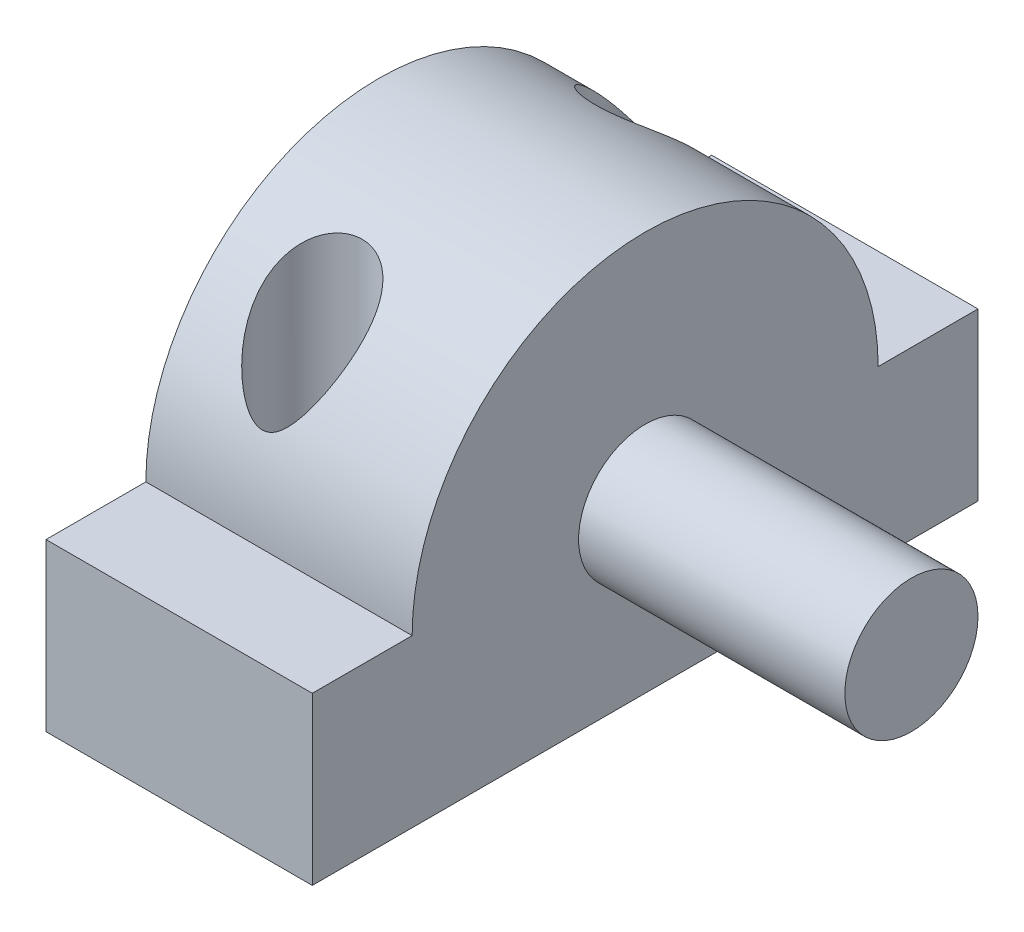
ISO-10303-21;
HEADER;
FILE_DESCRIPTION(('STEP AP214'),'2;1');
FILE_NAME('part.step','',(''),(''),'','','');
FILE_SCHEMA(('AUTOMOTIVE_DESIGN { 1 0 10303 214 1 1 1 1 }'));
ENDSEC;
DATA;
#1=APPLICATION_CONTEXT('core data for automotive mechanical design processes');
#2=APPLICATION_PROTOCOL_DEFINITION('international standard','automotive_design',2000,#1);
#3=PRODUCT_CONTEXT('',#1,'mechanical');
#4=PRODUCT('Part','Part','',(#3));
#5=PRODUCT_RELATED_PRODUCT_CATEGORY('part','',(#4));
#6=PRODUCT_DEFINITION_FORMATION('','',#4);
#7=PRODUCT_DEFINITION_CONTEXT('part definition',#1,'design');
#8=PRODUCT_DEFINITION('design','',#6,#7);
#9=PRODUCT_DEFINITION_SHAPE('','',#8);
#10=(LENGTH_UNIT() NAMED_UNIT(*) SI_UNIT(.MILLI.,.METRE.));
#11=(NAMED_UNIT(*) PLANE_ANGLE_UNIT() SI_UNIT($,.RADIAN.));
#12=(NAMED_UNIT(*) SI_UNIT($,.STERADIAN.) SOLID_ANGLE_UNIT());
#13=UNCERTAINTY_MEASURE_WITH_UNIT(LENGTH_MEASURE(1.E-05),#10,'distance_accuracy_value','');
#14=(GEOMETRIC_REPRESENTATION_CONTEXT(3) GLOBAL_UNCERTAINTY_ASSIGNED_CONTEXT((#13)) GLOBAL_UNIT_ASSIGNED_CONTEXT((#10,
#11,#12)) REPRESENTATION_CONTEXT('',''));
#15=CARTESIAN_POINT('',(0.,0.,0.));
#16=DIRECTION('',(0.,0.,1.));
#17=DIRECTION('',(1.,0.,0.));
#18=AXIS2_PLACEMENT_3D('',#15,#16,#17);
#19=CARTESIAN_POINT('',(8.,0.,0.));
#20=DIRECTION('',(0.,0.,-1.));
#21=DIRECTION('',(-1.,0.,0.));
#22=AXIS2_PLACEMENT_3D('',#19,#20,#21);
#23=PLANE('',#22);
#24=DIRECTION('',(0.,-1.,0.));
#25=VECTOR('',#24,1.);
#26=CARTESIAN_POINT('',(0.,0.,0.));
#27=LINE('',#26,#25);
#28=CARTESIAN_POINT('',(0.,0.,0.));
#29=VERTEX_POINT('',#28);
#30=CARTESIAN_POINT('',(0.,-5.,0.));
#31=VERTEX_POINT('',#30);
#32=EDGE_CURVE('E136',#29,#31,#27,.T.);
#33=ORIENTED_EDGE('',*,*,#32,.T.);
#34=DIRECTION('',(-1.,0.,0.));
#35=VECTOR('',#34,1.);
#36=CARTESIAN_POINT('',(8.,-5.,0.));
#37=LINE('',#36,#35);
#38=CARTESIAN_POINT('',(8.,-5.,0.));
#39=VERTEX_POINT('',#38);
#40=EDGE_CURVE('E11',#39,#31,#37,.T.);
#41=ORIENTED_EDGE('',*,*,#40,.F.);
#42=DIRECTION('',(0.,-1.,0.));
#43=VECTOR('',#42,1.);
#44=CARTESIAN_POINT('',(8.,0.,0.));
#45=LINE('',#44,#43);
#46=CARTESIAN_POINT('',(8.,0.,0.));
#47=VERTEX_POINT('',#46);
#48=EDGE_CURVE('E147',#47,#39,#45,.T.);
#49=ORIENTED_EDGE('',*,*,#48,.F.);
#50=DIRECTION('',(-1.,0.,0.));
#51=VECTOR('',#50,1.);
#52=CARTESIAN_POINT('',(8.,0.,0.));
#53=LINE('',#52,#51);
#54=EDGE_CURVE('E132',#47,#29,#53,.T.);
#55=ORIENTED_EDGE('',*,*,#54,.T.);
#56=EDGE_LOOP('',(#33,#41,#49,#55));
#57=FACE_BOUND('',#56,.T.);
#58=ADVANCED_FACE('F45',(#57),#23,.F.);
#59=CARTESIAN_POINT('',(8.,-5.,0.));
#60=DIRECTION('',(0.,1.,0.));
#61=DIRECTION('',(0.,0.,1.));
#62=AXIS2_PLACEMENT_3D('',#59,#60,#61);
#63=PLANE('',#62);
#64=CARTESIAN_POINT('',(3.,-5.,-5.));
#65=DIRECTION('',(0.,-1.,0.));
#66=DIRECTION('',(0.,0.,-1.));
#67=AXIS2_PLACEMENT_3D('',#64,#65,#66);
#68=CIRCLE('',#67,1.5);
#69=CARTESIAN_POINT('',(3.,-5.,-6.5));
#70=VERTEX_POINT('',#69);
#71=EDGE_CURVE('E158',#70,#70,#68,.T.);
#72=ORIENTED_EDGE('',*,*,#71,.F.);
#73=EDGE_LOOP('',(#72));
#74=FACE_BOUND('',#73,.T.);
#75=CARTESIAN_POINT('',(3.,-5.,-15.));
#76=DIRECTION('',(0.,-1.,0.));
#77=DIRECTION('',(0.,0.,1.));
#78=AXIS2_PLACEMENT_3D('',#75,#76,#77);
#79=CIRCLE('',#78,1.5);
#80=CARTESIAN_POINT('',(3.,-5.,-13.5));
#81=VERTEX_POINT('',#80);
#82=EDGE_CURVE('E212',#81,#81,#79,.T.);
#83=ORIENTED_EDGE('',*,*,#82,.F.);
#84=EDGE_LOOP('',(#83));
#85=FACE_BOUND('',#84,.T.);
#86=DIRECTION('',(0.,0.,-1.));
#87=VECTOR('',#86,1.);
#88=CARTESIAN_POINT('',(0.,-5.,0.));
#89=LINE('',#88,#87);
#90=CARTESIAN_POINT('',(0.,-5.,-20.));
#91=VERTEX_POINT('',#90);
#92=EDGE_CURVE('E139',#31,#91,#89,.T.);
#93=ORIENTED_EDGE('',*,*,#92,.T.);
#94=DIRECTION('',(-1.,0.,0.));
#95=VECTOR('',#94,1.);
#96=CARTESIAN_POINT('',(8.,-5.,-20.));
#97=LINE('',#96,#95);
#98=CARTESIAN_POINT('',(8.,-5.,-20.));
#99=VERTEX_POINT('',#98);
#100=EDGE_CURVE('E59',#99,#91,#97,.T.);
#101=ORIENTED_EDGE('',*,*,#100,.F.);
#102=DIRECTION('',(0.,0.,-1.));
#103=VECTOR('',#102,1.);
#104=CARTESIAN_POINT('',(8.,-5.,0.));
#105=LINE('',#104,#103);
#106=EDGE_CURVE('E105',#39,#99,#105,.T.);
#107=ORIENTED_EDGE('',*,*,#106,.F.);
#108=ORIENTED_EDGE('',*,*,#40,.T.);
#109=EDGE_LOOP('',(#93,#101,#107,#108));
#110=FACE_BOUND('',#109,.T.);
#111=ADVANCED_FACE('F191',(#74,#85,#110),#63,.F.);
#112=CARTESIAN_POINT('',(8.,0.,-20.));
#113=DIRECTION('',(0.,0.,1.));
#114=DIRECTION('',(1.,0.,0.));
#115=AXIS2_PLACEMENT_3D('',#112,#113,#114);
#116=PLANE('',#115);
#117=DIRECTION('',(0.,1.,0.));
#118=VECTOR('',#117,1.);
#119=CARTESIAN_POINT('',(0.,0.,-20.));
#120=LINE('',#119,#118);
#121=CARTESIAN_POINT('',(0.,0.,-20.));
#122=VERTEX_POINT('',#121);
#123=EDGE_CURVE('E142',#91,#122,#120,.T.);
#124=ORIENTED_EDGE('',*,*,#123,.T.);
#125=DIRECTION('',(-1.,0.,0.));
#126=VECTOR('',#125,1.);
#127=CARTESIAN_POINT('',(8.,0.,-20.));
#128=LINE('',#127,#126);
#129=CARTESIAN_POINT('',(8.,0.,-20.));
#130=VERTEX_POINT('',#129);
#131=EDGE_CURVE('E127',#130,#122,#128,.T.);
#132=ORIENTED_EDGE('',*,*,#131,.F.);
#133=DIRECTION('',(0.,1.,0.));
#134=VECTOR('',#133,1.);
#135=CARTESIAN_POINT('',(8.,0.,-20.));
#136=LINE('',#135,#134);
#137=EDGE_CURVE('E118',#99,#130,#136,.T.);
#138=ORIENTED_EDGE('',*,*,#137,.F.);
#139=ORIENTED_EDGE('',*,*,#100,.T.);
#140=EDGE_LOOP('',(#124,#132,#138,#139));
#141=FACE_BOUND('',#140,.T.);
#142=ADVANCED_FACE('F197',(#141),#116,.F.);
#143=CARTESIAN_POINT('',(8.,0.,-17.));
#144=DIRECTION('',(0.,-1.,0.));
#145=DIRECTION('',(0.,0.,-1.));
#146=AXIS2_PLACEMENT_3D('',#143,#144,#145);
#147=PLANE('',#146);
#148=DIRECTION('',(0.,0.,1.));
#149=VECTOR('',#148,1.);
#150=CARTESIAN_POINT('',(0.,0.,-17.));
#151=LINE('',#150,#149);
#152=CARTESIAN_POINT('',(0.,0.,-17.));
#153=VERTEX_POINT('',#152);
#154=EDGE_CURVE('E126',#122,#153,#151,.T.);
#155=ORIENTED_EDGE('',*,*,#154,.T.);
#156=DIRECTION('',(-1.,0.,0.));
#157=VECTOR('',#156,1.);
#158=CARTESIAN_POINT('',(8.,0.,-17.));
#159=LINE('',#158,#157);
#160=CARTESIAN_POINT('',(8.,0.,-17.));
#161=VERTEX_POINT('',#160);
#162=EDGE_CURVE('E123',#161,#153,#159,.T.);
#163=ORIENTED_EDGE('',*,*,#162,.F.);
#164=DIRECTION('',(0.,0.,1.));
#165=VECTOR('',#164,1.);
#166=CARTESIAN_POINT('',(8.,0.,-17.));
#167=LINE('',#166,#165);
#168=EDGE_CURVE('E112',#130,#161,#167,.T.);
#169=ORIENTED_EDGE('',*,*,#168,.F.);
#170=ORIENTED_EDGE('',*,*,#131,.T.);
#171=EDGE_LOOP('',(#155,#163,#169,#170));
#172=FACE_BOUND('',#171,.T.);
#173=ADVANCED_FACE('F124',(#172),#147,.F.);
#174=CARTESIAN_POINT('',(8.,0.,-10.));
#175=DIRECTION('',(-1.,0.,0.));
#176=DIRECTION('',(0.,0.,1.));
#177=AXIS2_PLACEMENT_3D('',#174,#175,#176);
#178=CYLINDRICAL_SURFACE('',#177,7.);
#179=CARTESIAN_POINT('',(3.,6.06217782649107,-6.5));
#180=CARTESIAN_POINT('',(3.07488724612899,6.06217677462976,-6.49999634374938));
#181=CARTESIAN_POINT('',(3.14988624091181,6.0589302713698,-6.49435644566424));
#182=CARTESIAN_POINT('',(3.29775974677453,6.0459724803858,-6.47205774478669));
#183=CARTESIAN_POINT('',(3.37062905275264,6.03624654463625,-6.45537397570824));
#184=CARTESIAN_POINT('',(3.51188865566737,6.01049479681937,-6.41188299750404));
#185=CARTESIAN_POINT('',(3.58029019650692,5.9944855713019,-6.38510244900321));
#186=CARTESIAN_POINT('',(3.71106599554074,5.95643101131848,-6.32273786800935));
#187=CARTESIAN_POINT('',(3.77344269810746,5.93438813883361,-6.28715742681158));
#188=CARTESIAN_POINT('',(3.89292525958971,5.88379941758364,-6.20748150702812));
#189=CARTESIAN_POINT('',(3.94978516839445,5.85506078959614,-6.1631411109325));
#190=CARTESIAN_POINT('',(4.05496144917599,5.79205373694304,-6.06867227857916));
#191=CARTESIAN_POINT('',(4.10327468693715,5.75778329243689,-6.01854173006338));
#192=CARTESIAN_POINT('',(4.19602252113023,5.68016067501728,-5.90844851594702));
#193=CARTESIAN_POINT('',(4.23940177401288,5.63621985297474,-5.84801495280211));
#194=CARTESIAN_POINT('',(4.315428429894,5.54312300713837,-5.72451251700034));
#195=CARTESIAN_POINT('',(4.34806891256743,5.49396364727133,-5.66144197439642));
#196=CARTESIAN_POINT('',(4.4167546955706,5.36613782400882,-5.50341581278758));
#197=CARTESIAN_POINT('',(4.44666359778181,5.2847950322343,-5.40794604740489));
#198=CARTESIAN_POINT('',(4.48702326248985,5.11482709893844,-5.21933503664093));
#199=CARTESIAN_POINT('',(4.49743163483481,5.02618652885623,-5.12619929722758));
#200=CARTESIAN_POINT('',(4.50104902374122,4.87255488254904,-4.97347088141769));
#201=CARTESIAN_POINT('',(4.49864351739466,4.80891094018342,-4.91255459865941));
#202=CARTESIAN_POINT('',(4.48691798287046,4.67971570857437,-4.79346831181909));
#203=CARTESIAN_POINT('',(4.4775975223072,4.61416430030517,-4.73529847971197));
#204=CARTESIAN_POINT('',(4.45273959729481,4.48154486847538,-4.6219540018488));
#205=CARTESIAN_POINT('',(4.43719432490148,4.41447504038028,-4.56678321695874));
#206=CARTESIAN_POINT('',(4.40045785583339,4.27931491601703,-4.45970247839746));
#207=CARTESIAN_POINT('',(4.37926743029367,4.21122476032494,-4.4077920805492));
#208=CARTESIAN_POINT('',(4.33095803210965,4.07240049920133,-4.30586401596733));
#209=CARTESIAN_POINT('',(4.30368372443732,4.00164732927497,-4.25594618178696));
#210=CARTESIAN_POINT('',(4.24386068990434,3.85989916659202,-4.15975035645615));
#211=CARTESIAN_POINT('',(4.21131180482271,3.78890416664384,-4.11347247455487));
#212=CARTESIAN_POINT('',(4.14098406635786,3.64716476638046,-4.02461879109314));
#213=CARTESIAN_POINT('',(4.10320460699923,3.57642039607669,-3.98204341940978));
#214=CARTESIAN_POINT('',(4.02220307231857,3.43591555156199,-3.90073146296065));
#215=CARTESIAN_POINT('',(3.97898388887663,3.36615457630842,-3.86199285789354));
#216=CARTESIAN_POINT('',(3.8798090265835,3.21864912727658,-3.78323181836819));
#217=CARTESIAN_POINT('',(3.82291578996759,3.14119045536872,-3.74381869853061));
#218=CARTESIAN_POINT('',(3.73015307569975,3.0291543535705,-3.68921869834723));
#219=CARTESIAN_POINT('',(3.6980432869428,2.99254753229684,-3.67179243844725));
#220=CARTESIAN_POINT('',(3.63088846263601,2.92134191886284,-3.63860900282595));
#221=CARTESIAN_POINT('',(3.59584586051998,2.88674150151201,-3.62285046746037));
#222=CARTESIAN_POINT('',(3.52621368996409,2.82409961021022,-3.59488413495186));
#223=CARTESIAN_POINT('',(3.4919823889331,2.79575315285715,-3.58247669824057));
#224=CARTESIAN_POINT('',(3.42022037285386,2.74257567142704,-3.5595719159984));
#225=CARTESIAN_POINT('',(3.38268960969438,2.71774469862497,-3.54907459832685));
#226=CARTESIAN_POINT('',(3.30970845793241,2.67662176252767,-3.53191530166755));
#227=CARTESIAN_POINT('',(3.27475031859164,2.65961299069627,-3.5249174757353));
#228=CARTESIAN_POINT('',(3.20230836225991,2.63104470432912,-3.51325622013703));
#229=CARTESIAN_POINT('',(3.16483069686261,2.61947243167818,-3.50858732344287));
#230=CARTESIAN_POINT('',(3.0952089702251,2.60481996245347,-3.50269560855217));
#231=CARTESIAN_POINT('',(3.06335642997214,2.60056698943998,-3.50099595542385));
#232=CARTESIAN_POINT('',(2.99933910055876,2.59722432840553,-3.49965923742424));
#233=CARTESIAN_POINT('',(2.96717445835228,2.59813231789171,-3.50002124478201));
#234=CARTESIAN_POINT('',(2.90358057557784,2.60498319234335,-3.50276409220987));
#235=CARTESIAN_POINT('',(2.87214961070624,2.61091271627619,-3.50513957494601));
#236=CARTESIAN_POINT('',(2.81063034627651,2.6271212596488,-3.5116789939386));
#237=CARTESIAN_POINT('',(2.78054349134558,2.63740484006335,-3.51584480567509));
#238=CARTESIAN_POINT('',(2.70467025281412,2.66859541178565,-3.52859978469833));
#239=CARTESIAN_POINT('',(2.66019365694696,2.69218272747631,-3.53834606009046));
#240=CARTESIAN_POINT('',(2.57554205170607,2.74507374800841,-3.56063684660925));
#241=CARTESIAN_POINT('',(2.53538239379682,2.77439687147958,-3.57319088474469));
#242=CARTESIAN_POINT('',(2.45948573723692,2.83614122989274,-3.60020151653892));
#243=CARTESIAN_POINT('',(2.42368526244188,2.86850146032465,-3.61462221700708));
#244=CARTESIAN_POINT('',(2.35512608722087,2.93557413784138,-3.64517737337876));
#245=CARTESIAN_POINT('',(2.32237043013347,2.97028887962106,-3.66131351008476));
#246=CARTESIAN_POINT('',(2.22784672329253,3.076902198012,-3.71200836267158));
#247=CARTESIAN_POINT('',(2.16994533282429,3.1511607865734,-3.74880665612383));
#248=CARTESIAN_POINT('',(2.06268566025289,3.30182194016055,-3.82706304267076));
#249=CARTESIAN_POINT('',(2.01324779920348,3.37819567002254,-3.868470903232));
#250=CARTESIAN_POINT('',(1.92107937133774,3.53238357932364,-3.95598416283341));
#251=CARTESIAN_POINT('',(1.8783543383305,3.6101988886912,-4.00209338641199));
#252=CARTESIAN_POINT('',(1.79919626586278,3.76636025693809,-4.09889929315403));
#253=CARTESIAN_POINT('',(1.76277306560236,3.84470695080468,-4.14960296500745));
#254=CARTESIAN_POINT('',(1.69633682046079,4.00112300924113,-4.25544329469505));
#255=CARTESIAN_POINT('',(1.66632350441654,4.07919238540515,-4.31057976486869));
#256=CARTESIAN_POINT('',(1.61211589215235,4.23724815399855,-4.42723445494009));
#257=CARTESIAN_POINT('',(1.58816787199091,4.31720335410463,-4.48891031997641));
#258=CARTESIAN_POINT('',(1.54824405880129,4.47558462474626,-4.61673887057073));
#259=CARTESIAN_POINT('',(1.53227106024319,4.55401015004254,-4.6828931161582));
#260=CARTESIAN_POINT('',(1.50936200764066,4.70831713386748,-4.8190454679915));
#261=CARTESIAN_POINT('',(1.50239117831629,4.78420727238715,-4.88902768741363));
#262=CARTESIAN_POINT('',(1.49863843931101,4.93289050511262,-5.03238060552076));
#263=CARTESIAN_POINT('',(1.50184662807992,5.00568653925189,-5.10574794292497));
#264=CARTESIAN_POINT('',(1.52091374724344,5.15515579980584,-5.26318733607478));
#265=CARTESIAN_POINT('',(1.53813153146209,5.23136847582664,-5.34754637445085));
#266=CARTESIAN_POINT('',(1.58912316647582,5.37723028160116,-5.5169387243532));
#267=CARTESIAN_POINT('',(1.62287537006836,5.44688785167307,-5.60197101162939));
#268=CARTESIAN_POINT('',(1.70151784950505,5.56666989577079,-5.75500515148338));
#269=CARTESIAN_POINT('',(1.74354030151497,5.61810209173191,-5.82344531584494));
#270=CARTESIAN_POINT('',(1.84092653707535,5.71401226899974,-5.95565545590606));
#271=CARTESIAN_POINT('',(1.89628675637939,5.75849210295658,-6.01942667336016));
#272=CARTESIAN_POINT('',(2.02064184686832,5.83965530391415,-6.13946516165303));
#273=CARTESIAN_POINT('',(2.08974186319276,5.87627371201284,-6.19566857957846));
#274=CARTESIAN_POINT('',(2.23990304282745,5.94021830878181,-6.29630129881475));
#275=CARTESIAN_POINT('',(2.32096036433081,5.96754747274355,-6.34073436909221));
#276=CARTESIAN_POINT('',(2.47987116638816,6.00895693056789,-6.40920510202472));
#277=CARTESIAN_POINT('',(2.55651755813275,6.02437504447831,-6.43525364661646));
#278=CARTESIAN_POINT('',(2.71396889650055,6.04754252519674,-6.47469655710258));
#279=CARTESIAN_POINT('',(2.79476046443728,6.05531510893048,-6.48812922754911));
#280=CARTESIAN_POINT('',(2.8967274773751,6.06020467445738,-6.49658466813937));
#281=CARTESIAN_POINT('',(2.91735185690542,6.06094418966186,-6.49786403155561));
#282=CARTESIAN_POINT('',(2.95864798383547,6.06193090940145,-6.49957219971063));
#283=CARTESIAN_POINT('',(2.97931973094305,6.06217811696476,-6.50000100968123));
#284=CARTESIAN_POINT('',(3.,6.06217782649107,-6.5));
#285=B_SPLINE_CURVE_WITH_KNOTS('',3,(#179,#180,#181,#182,#183,#184,#185,#186,#187,#188,#189,
#190,#191,#192,#193,#194,#195,#196,#197,#198,#199,#200,#201,#202,#203,#204,#205,#206,#207,#208,
#209,#210,#211,#212,#213,#214,#215,#216,#217,#218,#219,#220,#221,#222,#223,#224,#225,#226,#227,
#228,#229,#230,#231,#232,#233,#234,#235,#236,#237,#238,#239,#240,#241,#242,#243,#244,#245,#246,
#247,#248,#249,#250,#251,#252,#253,#254,#255,#256,#257,#258,#259,#260,#261,#262,#263,#264,#265,
#266,#267,#268,#269,#270,#271,#272,#273,#274,#275,#276,#277,#278,#279,#280,#281,#282,#283,#284),
.UNSPECIFIED.,.T.,.F.,(4,2,2,2,2,2,2,2,2,2,2,2,2,2,2,2,2,2,2,2,2,2,2,2,2,2,2,2,2,2,2,2,2,2,2,2,
2,2,2,2,2,2,2,2,2,2,2,2,2,2,2,2,4),(0.,0.22457800782261,0.449665448877575,0.674162660707472,
0.898568404462459,1.13047688297963,1.36247023093483,1.62068110586384,1.87905805371998,
2.26374806478361,2.6492733471073,2.91334183514724,3.1774268365345,3.44184412949029,
3.70622532121499,3.97834275049454,4.25046834396562,4.52262549030446,4.79463855809113,
5.10556994036694,5.260618189636,5.41553904295768,5.55376204682154,5.69198706652368,
5.81009396637873,5.92792229673463,6.02401377110962,6.12006200663358,6.21585548214175,
6.31174955276601,6.46469825078019,6.61817401138804,6.76904584855409,6.92006689828411,
7.22261802709004,7.52214618438217,7.82191998061111,8.12215767791002,8.42238267146595,
8.733336456753,9.04439912478951,9.35425653092469,9.66381261843944,10.0075777555188,
10.3508940261867,10.6358630365438,10.9207559790437,11.2079193729699,11.4949907032503,
11.7409004091011,11.9860610423969,12.048079108676,12.110096793477),.UNSPECIFIED.);
#286=CARTESIAN_POINT('',(3.,6.06217782649107,-6.5));
#287=VERTEX_POINT('',#286);
#288=EDGE_CURVE('E48',#287,#287,#285,.T.);
#289=ORIENTED_EDGE('',*,*,#288,.T.);
#290=EDGE_LOOP('',(#289));
#291=FACE_BOUND('',#290,.T.);
#292=CARTESIAN_POINT('',(3.,2.59807621135332,-16.5));
#293=CARTESIAN_POINT('',(3.03621051367618,2.59807496525115,-16.5000004540823));
#294=CARTESIAN_POINT('',(3.07241785881279,2.60140300638932,-16.4986731473966));
#295=CARTESIAN_POINT('',(3.14357448190675,2.61418551289894,-16.4935413053377));
#296=CARTESIAN_POINT('',(3.17852108564154,2.62365227556757,-16.4897317974599));
#297=CARTESIAN_POINT('',(3.25669192170981,2.65116177914567,-16.4785506494855));
#298=CARTESIAN_POINT('',(3.29918417145735,2.67094078008236,-16.4704463937216));
#299=CARTESIAN_POINT('',(3.38035006389322,2.71619722256609,-16.4515791497761));
#300=CARTESIAN_POINT('',(3.41901374265664,2.74168899739179,-16.4408094668504));
#301=CARTESIAN_POINT('',(3.49048151509668,2.79463402145742,-16.4180058312523));
#302=CARTESIAN_POINT('',(3.52350271653074,2.82185461251748,-16.4060982745087));
#303=CARTESIAN_POINT('',(3.586950243091,2.87856724435932,-16.3808165476753));
#304=CARTESIAN_POINT('',(3.61737416057911,2.90806134547999,-16.367441042513));
#305=CARTESIAN_POINT('',(3.70542908913123,2.99900557602951,-16.3253779734551));
#306=CARTESIAN_POINT('',(3.75971321275101,3.06281304457453,-16.2947981268239));
#307=CARTESIAN_POINT('',(3.86356677788234,3.19636190172221,-16.2280905819552));
#308=CARTESIAN_POINT('',(3.91283410906062,3.26624042091583,-16.1917811773674));
#309=CARTESIAN_POINT('',(4.00519245834409,3.40785019456434,-16.1149858417935));
#310=CARTESIAN_POINT('',(4.04827770985844,3.4795831061295,-16.0744960711481));
#311=CARTESIAN_POINT('',(4.12886103617834,3.6239423734971,-15.989496874301));
#312=CARTESIAN_POINT('',(4.16635158279676,3.69656979328237,-15.9449821591531));
#313=CARTESIAN_POINT('',(4.23585484147146,3.84196513785473,-15.8520721805626));
#314=CARTESIAN_POINT('',(4.2678673479677,3.91473306781082,-15.8036767715994));
#315=CARTESIAN_POINT('',(4.32829553646531,4.06485308268827,-15.6996375831466));
#316=CARTESIAN_POINT('',(4.35631582735112,4.14217854664856,-15.6437244678798));
#317=CARTESIAN_POINT('',(4.40554600661436,4.29585335225798,-15.5276504553148));
#318=CARTESIAN_POINT('',(4.42675393063864,4.37220240627555,-15.4674883389022));
#319=CARTESIAN_POINT('',(4.46160920714567,4.5231398068205,-15.3432880905423));
#320=CARTESIAN_POINT('',(4.47527655362799,4.59773230260351,-15.2792607130383));
#321=CARTESIAN_POINT('',(4.49420196776401,4.74469175114558,-15.1475850611513));
#322=CARTESIAN_POINT('',(4.49946533524619,4.81706007827239,-15.079939096613));
#323=CARTESIAN_POINT('',(4.50059007947848,4.97784209201204,-14.9230891596856));
#324=CARTESIAN_POINT('',(4.49357333499611,5.06539455078751,-14.8329427733898));
#325=CARTESIAN_POINT('',(4.46149685744455,5.23400759771309,-14.6497949913645));
#326=CARTESIAN_POINT('',(4.43645862974895,5.31507579565403,-14.5567971248796));
#327=CARTESIAN_POINT('',(4.37242216119916,5.45370090346652,-14.3893736931884));
#328=CARTESIAN_POINT('',(4.33705329804806,5.51277497616457,-14.3148295460633));
#329=CARTESIAN_POINT('',(4.25159700948248,5.62388923942213,-14.1689614829919));
#330=CARTESIAN_POINT('',(4.20152611035668,5.67593723248963,-14.0976340544865));
#331=CARTESIAN_POINT('',(4.09558570403978,5.76387656852717,-13.9727332848493));
#332=CARTESIAN_POINT('',(4.04195063301174,5.80101991346495,-13.918151121932));
#333=CARTESIAN_POINT('',(3.92448175394363,5.86858764094734,-13.8162046709244));
#334=CARTESIAN_POINT('',(3.86065063371275,5.89901378920964,-13.7688384870209));
#335=CARTESIAN_POINT('',(3.72362944621189,5.95261576708631,-13.6836025277306));
#336=CARTESIAN_POINT('',(3.65039187126331,5.97575257840507,-13.6457840665081));
#337=CARTESIAN_POINT('',(3.49689096881011,6.0140508063797,-13.5822595680155));
#338=CARTESIAN_POINT('',(3.41663029532259,6.02921522073835,-13.5565489784415));
#339=CARTESIAN_POINT('',(3.25994312667852,6.05019569036926,-13.5207271006035));
#340=CARTESIAN_POINT('',(3.18391009067779,6.05678137923209,-13.5093354405111));
#341=CARTESIAN_POINT('',(3.03072529175682,6.06313240764448,-13.4983524673046));
#342=CARTESIAN_POINT('',(2.9535739422618,6.06290020648474,-13.4987568992052));
#343=CARTESIAN_POINT('',(2.80410332805438,6.05579174032447,-13.5110438226328));
#344=CARTESIAN_POINT('',(2.7317249997686,6.04922147606881,-13.5223976706844));
#345=CARTESIAN_POINT('',(2.59016702208715,6.02997417127874,-13.5552454773784));
#346=CARTESIAN_POINT('',(2.52098716670026,6.01729752461575,-13.5767387820079));
#347=CARTESIAN_POINT('',(2.38681967294729,5.9858401759246,-13.6291397425305));
#348=CARTESIAN_POINT('',(2.32189010299547,5.96699024252345,-13.6601539124045));
#349=CARTESIAN_POINT('',(2.19855504496458,5.9235333580372,-13.7300726411811));
#350=CARTESIAN_POINT('',(2.14015085355286,5.89892526573551,-13.7689787639958));
#351=CARTESIAN_POINT('',(2.02726333174947,5.84256842790205,-13.8558055266851));
#352=CARTESIAN_POINT('',(1.97328892454207,5.8104570245609,-13.9041502201816));
#353=CARTESIAN_POINT('',(1.87446428649586,5.74077201715273,-14.0059134731183));
#354=CARTESIAN_POINT('',(1.82961720082735,5.70319653784911,-14.0593337722842));
#355=CARTESIAN_POINT('',(1.74394692586535,5.61811349238055,-14.176442533051));
#356=CARTESIAN_POINT('',(1.70437846311174,5.56995016087042,-14.2405690015771));
#357=CARTESIAN_POINT('',(1.63643966219784,5.4684894874897,-14.3706359185177));
#358=CARTESIAN_POINT('',(1.60807793821345,5.41518823529673,-14.4365777208249));
#359=CARTESIAN_POINT('',(1.54944310604014,5.2750472454677,-14.6033821167479));
#360=CARTESIAN_POINT('',(1.5260716589327,5.18536203217502,-14.7042943203941));
#361=CARTESIAN_POINT('',(1.49986410506026,4.99882149812191,-14.9020788861854));
#362=CARTESIAN_POINT('',(1.49706634363458,4.90195312844623,-14.9989433703888));
#363=CARTESIAN_POINT('',(1.50682702309573,4.73467986766722,-15.1567016659168));
#364=CARTESIAN_POINT('',(1.5148242448899,4.66555487358846,-15.2193118675536));
#365=CARTESIAN_POINT('',(1.5379952357137,4.52555313752582,-15.34115845944));
#366=CARTESIAN_POINT('',(1.55316938171101,4.45467630371196,-15.4003946722879));
#367=CARTESIAN_POINT('',(1.5900340568197,4.31145321169182,-15.51541832721));
#368=CARTESIAN_POINT('',(1.61174578042338,4.23910289879905,-15.5711938295939));
#369=CARTESIAN_POINT('',(1.66113478330926,4.09364118123522,-15.6789339962367));
#370=CARTESIAN_POINT('',(1.6888108006068,4.02052994067851,-15.7308994635481));
#371=CARTESIAN_POINT('',(1.7507048328144,3.87187032507609,-15.8324056321186));
#372=CARTESIAN_POINT('',(1.78509031754159,3.79631313859274,-15.8818311767394));
#373=CARTESIAN_POINT('',(1.85977061625643,3.64549167389362,-15.976479880802));
#374=CARTESIAN_POINT('',(1.90006488009677,3.57022736907757,-16.0217034308384));
#375=CARTESIAN_POINT('',(1.98664021817725,3.42117480604802,-16.1076121229977));
#376=CARTESIAN_POINT('',(2.03289031103307,3.34738104468649,-16.1483188521328));
#377=CARTESIAN_POINT('',(2.13229654968002,3.20217729106151,-16.2251723970959));
#378=CARTESIAN_POINT('',(2.18544319456698,3.13076418618187,-16.2613253537477));
#379=CARTESIAN_POINT('',(2.27849002802343,3.01893698386031,-16.3157178852992));
#380=CARTESIAN_POINT('',(2.31572312119137,2.97707795350088,-16.3355347509337));
#381=CARTESIAN_POINT('',(2.39431992155655,2.89606818613096,-16.3729724154557));
#382=CARTESIAN_POINT('',(2.43569333591872,2.85692419613535,-16.3905878249103));
#383=CARTESIAN_POINT('',(2.52401898670739,2.78266963916232,-16.4232711381));
#384=CARTESIAN_POINT('',(2.57104164301937,2.74762370697093,-16.4382996309634));
#385=CARTESIAN_POINT('',(2.6711476734699,2.68561510057034,-16.4644100106907));
#386=CARTESIAN_POINT('',(2.72419816679578,2.6586112307889,-16.4755120676854));
#387=CARTESIAN_POINT('',(2.81514277235624,2.6255032893693,-16.4889852835867));
#388=CARTESIAN_POINT('',(2.85127609209355,2.61535963901557,-16.4930690383621));
#389=CARTESIAN_POINT('',(2.92494309016771,2.60165451725676,-16.4985730163957));
#390=CARTESIAN_POINT('',(2.96247324662225,2.59807750275087,-16.499999529412));
#391=CARTESIAN_POINT('',(3.,2.59807621135332,-16.5));
#392=B_SPLINE_CURVE_WITH_KNOTS('',3,(#292,#293,#294,#295,#296,#297,#298,#299,#300,#301,#302,
#303,#304,#305,#306,#307,#308,#309,#310,#311,#312,#313,#314,#315,#316,#317,#318,#319,#320,#321,
#322,#323,#324,#325,#326,#327,#328,#329,#330,#331,#332,#333,#334,#335,#336,#337,#338,#339,#340,
#341,#342,#343,#344,#345,#346,#347,#348,#349,#350,#351,#352,#353,#354,#355,#356,#357,#358,#359,
#360,#361,#362,#363,#364,#365,#366,#367,#368,#369,#370,#371,#372,#373,#374,#375,#376,#377,#378,
#379,#380,#381,#382,#383,#384,#385,#386,#387,#388,#389,#390,#391),.UNSPECIFIED.,.T.,.F.,(4,2,2,
2,2,2,2,2,2,2,2,2,2,2,2,2,2,2,2,2,2,2,2,2,2,2,2,2,2,2,2,2,2,2,2,2,2,2,2,2,2,2,2,2,2,2,2,2,2,4),
(0.,0.108466171465434,0.217150300141978,0.359030969105363,0.501271681574416,0.634335404810715,
0.767521165989352,1.03440582986332,1.31273829173994,1.59132871504265,1.87029069104236,
2.14926313262222,2.44730315214392,2.74542903483261,3.04276058417915,3.33990455220469,
3.71620512174618,4.0920573876844,4.39533125304962,4.69826551045896,4.95238628806484,
5.20644018639788,5.46183174388353,5.71712720272502,5.94743839195851,6.17766650633998,
6.39730818700605,6.61693570233005,6.8391158151139,7.06133999939945,7.29814938754409,
7.53504023983718,7.80232781361206,8.06982044293218,8.47858807082093,8.8881173692395,
9.16859603470506,9.44908943393826,9.73050215236035,10.0118553850373,10.3014264836021,
10.590970638237,10.8790652607177,11.1667671269797,11.3448632910598,11.5233872534032,
11.7044277539277,11.8845242572843,11.9972001840644,12.1096090635078),.UNSPECIFIED.);
#393=CARTESIAN_POINT('',(3.,2.59807621135332,-16.5));
#394=VERTEX_POINT('',#393);
#395=EDGE_CURVE('E152',#394,#394,#392,.T.);
#396=ORIENTED_EDGE('',*,*,#395,.T.);
#397=EDGE_LOOP('',(#396));
#398=FACE_BOUND('',#397,.T.);
#399=CARTESIAN_POINT('',(0.,0.,-10.));
#400=DIRECTION('',(1.,0.,0.));
#401=DIRECTION('',(0.,0.,-1.));
#402=AXIS2_PLACEMENT_3D('',#399,#400,#401);
#403=CIRCLE('',#402,7.);
#404=CARTESIAN_POINT('',(0.,0.,-3.));
#405=VERTEX_POINT('',#404);
#406=EDGE_CURVE('E91',#153,#405,#403,.T.);
#407=ORIENTED_EDGE('',*,*,#406,.T.);
#408=DIRECTION('',(-1.,0.,0.));
#409=VECTOR('',#408,1.);
#410=CARTESIAN_POINT('',(8.,0.,-3.));
#411=LINE('',#410,#409);
#412=CARTESIAN_POINT('',(8.,0.,-3.));
#413=VERTEX_POINT('',#412);
#414=EDGE_CURVE('E128',#413,#405,#411,.T.);
#415=ORIENTED_EDGE('',*,*,#414,.F.);
#416=CARTESIAN_POINT('',(8.,0.,-10.));
#417=DIRECTION('',(1.,0.,0.));
#418=DIRECTION('',(0.,0.,-1.));
#419=AXIS2_PLACEMENT_3D('',#416,#417,#418);
#420=CIRCLE('',#419,7.);
#421=EDGE_CURVE('E116',#161,#413,#420,.T.);
#422=ORIENTED_EDGE('',*,*,#421,.F.);
#423=ORIENTED_EDGE('',*,*,#162,.T.);
#424=EDGE_LOOP('',(#407,#415,#422,#423));
#425=FACE_BOUND('',#424,.T.);
#426=ADVANCED_FACE('F130',(#291,#398,#425),#178,.T.);
#427=CARTESIAN_POINT('',(8.,0.,0.));
#428=DIRECTION('',(0.,-1.,0.));
#429=DIRECTION('',(0.,0.,-1.));
#430=AXIS2_PLACEMENT_3D('',#427,#428,#429);
#431=PLANE('',#430);
#432=DIRECTION('',(0.,0.,1.));
#433=VECTOR('',#432,1.);
#434=CARTESIAN_POINT('',(0.,0.,0.));
#435=LINE('',#434,#433);
#436=EDGE_CURVE('E97',#405,#29,#435,.T.);
#437=ORIENTED_EDGE('',*,*,#436,.T.);
#438=ORIENTED_EDGE('',*,*,#54,.F.);
#439=DIRECTION('',(0.,0.,1.));
#440=VECTOR('',#439,1.);
#441=CARTESIAN_POINT('',(8.,0.,0.));
#442=LINE('',#441,#440);
#443=EDGE_CURVE('E68',#413,#47,#442,.T.);
#444=ORIENTED_EDGE('',*,*,#443,.F.);
#445=ORIENTED_EDGE('',*,*,#414,.T.);
#446=EDGE_LOOP('',(#437,#438,#444,#445));
#447=FACE_BOUND('',#446,.T.);
#448=ADVANCED_FACE('F180',(#447),#431,.F.);
#449=CARTESIAN_POINT('',(8.,0.,-10.));
#450=DIRECTION('',(1.,0.,0.));
#451=DIRECTION('',(0.,0.,-1.));
#452=AXIS2_PLACEMENT_3D('',#449,#450,#451);
#453=PLANE('',#452);
#454=CARTESIAN_POINT('',(8.,0.,-10.));
#455=DIRECTION('',(1.,0.,0.));
#456=DIRECTION('',(0.,0.,-1.));
#457=AXIS2_PLACEMENT_3D('',#454,#455,#456);
#458=CIRCLE('',#457,2.);
#459=CARTESIAN_POINT('',(8.,0.,-12.));
#460=VERTEX_POINT('',#459);
#461=EDGE_CURVE('E207',#460,#460,#458,.T.);
#462=ORIENTED_EDGE('',*,*,#461,.F.);
#463=EDGE_LOOP('',(#462));
#464=FACE_BOUND('',#463,.T.);
#465=ORIENTED_EDGE('',*,*,#48,.T.);
#466=ORIENTED_EDGE('',*,*,#106,.T.);
#467=ORIENTED_EDGE('',*,*,#137,.T.);
#468=ORIENTED_EDGE('',*,*,#168,.T.);
#469=ORIENTED_EDGE('',*,*,#421,.T.);
#470=ORIENTED_EDGE('',*,*,#443,.T.);
#471=EDGE_LOOP('',(#465,#466,#467,#468,#469,#470));
#472=FACE_BOUND('',#471,.T.);
#473=ADVANCED_FACE('F114',(#464,#472),#453,.T.);
#474=CARTESIAN_POINT('',(0.,0.,-10.));
#475=DIRECTION('',(1.,0.,0.));
#476=DIRECTION('',(0.,0.,-1.));
#477=AXIS2_PLACEMENT_3D('',#474,#475,#476);
#478=PLANE('',#477);
#479=ORIENTED_EDGE('',*,*,#32,.F.);
#480=ORIENTED_EDGE('',*,*,#436,.F.);
#481=ORIENTED_EDGE('',*,*,#406,.F.);
#482=ORIENTED_EDGE('',*,*,#154,.F.);
#483=ORIENTED_EDGE('',*,*,#123,.F.);
#484=ORIENTED_EDGE('',*,*,#92,.F.);
#485=EDGE_LOOP('',(#479,#480,#481,#482,#483,#484));
#486=FACE_BOUND('',#485,.T.);
#487=ADVANCED_FACE('F176',(#486),#478,.F.);
#488=CARTESIAN_POINT('',(16.,0.,-10.));
#489=DIRECTION('',(-1.,0.,0.));
#490=DIRECTION('',(0.,0.,1.));
#491=AXIS2_PLACEMENT_3D('',#488,#489,#490);
#492=CYLINDRICAL_SURFACE('',#491,2.);
#493=CARTESIAN_POINT('',(16.,0.,-10.));
#494=DIRECTION('',(1.,0.,0.));
#495=DIRECTION('',(0.,0.,-1.));
#496=AXIS2_PLACEMENT_3D('',#493,#494,#495);
#497=CIRCLE('',#496,2.);
#498=CARTESIAN_POINT('',(16.,0.,-12.));
#499=VERTEX_POINT('',#498);
#500=EDGE_CURVE('E140',#499,#499,#497,.T.);
#501=ORIENTED_EDGE('',*,*,#500,.F.);
#502=EDGE_LOOP('',(#501));
#503=FACE_BOUND('',#502,.T.);
#504=ORIENTED_EDGE('',*,*,#461,.T.);
#505=EDGE_LOOP('',(#504));
#506=FACE_BOUND('',#505,.T.);
#507=ADVANCED_FACE('F172',(#503,#506),#492,.T.);
#508=CARTESIAN_POINT('',(16.,0.,-10.));
#509=DIRECTION('',(1.,0.,0.));
#510=DIRECTION('',(0.,0.,-1.));
#511=AXIS2_PLACEMENT_3D('',#508,#509,#510);
#512=PLANE('',#511);
#513=ORIENTED_EDGE('',*,*,#500,.T.);
#514=EDGE_LOOP('',(#513));
#515=FACE_BOUND('',#514,.T.);
#516=ADVANCED_FACE('F167',(#515),#512,.T.);
#517=CARTESIAN_POINT('',(3.,10.,-15.));
#518=DIRECTION('',(0.,-1.,0.));
#519=DIRECTION('',(0.,0.,-1.));
#520=AXIS2_PLACEMENT_3D('',#517,#518,#519);
#521=CYLINDRICAL_SURFACE('',#520,1.5);
#522=ORIENTED_EDGE('',*,*,#82,.T.);
#523=EDGE_LOOP('',(#522));
#524=FACE_BOUND('',#523,.T.);
#525=ORIENTED_EDGE('',*,*,#395,.F.);
#526=EDGE_LOOP('',(#525));
#527=FACE_BOUND('',#526,.T.);
#528=ADVANCED_FACE('F162',(#524,#527),#521,.F.);
#529=CARTESIAN_POINT('',(3.,10.,-5.));
#530=DIRECTION('',(0.,-1.,0.));
#531=DIRECTION('',(0.,0.,-1.));
#532=AXIS2_PLACEMENT_3D('',#529,#530,#531);
#533=CYLINDRICAL_SURFACE('',#532,1.5);
#534=ORIENTED_EDGE('',*,*,#71,.T.);
#535=EDGE_LOOP('',(#534));
#536=FACE_BOUND('',#535,.T.);
#537=ORIENTED_EDGE('',*,*,#288,.F.);
#538=EDGE_LOOP('',(#537));
#539=FACE_BOUND('',#538,.T.);
#540=ADVANCED_FACE('F166',(#536,#539),#533,.F.);
#541=CLOSED_SHELL('',(#58,#111,#142,#173,#426,#448,#473,#487,#507,#516,#528,#540));
#542=MANIFOLD_SOLID_BREP('B2',#541);
#543=ADVANCED_BREP_SHAPE_REPRESENTATION('',(#18,#542),#14);
#544=SHAPE_DEFINITION_REPRESENTATION(#9,#543);
ENDSEC;
END-ISO-10303-21;
